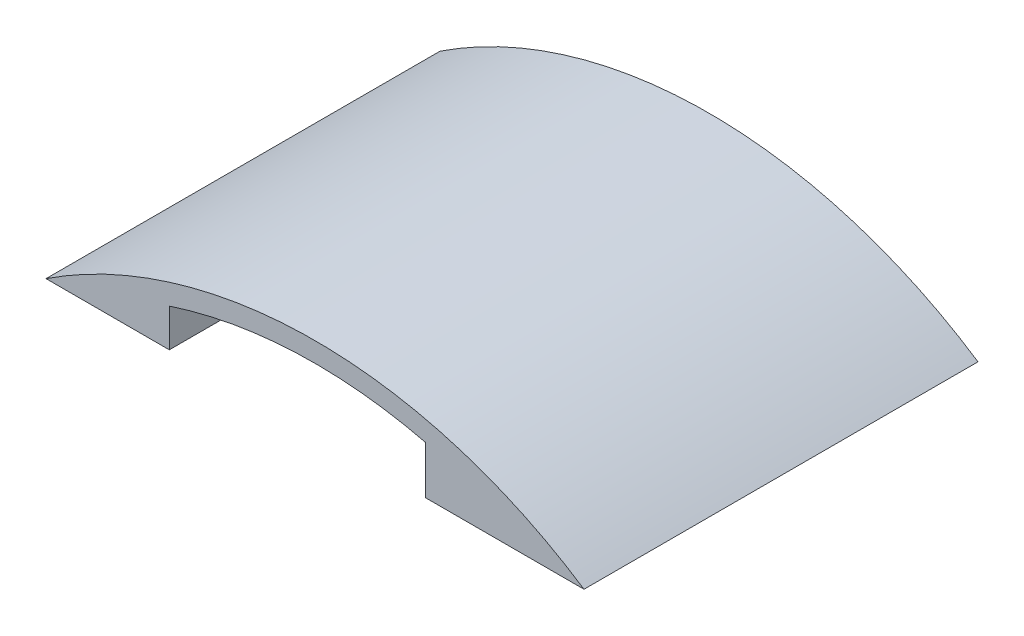
ISO-10303-21;
HEADER;
FILE_DESCRIPTION(('STEP AP214'),'2;1');
FILE_NAME('part.step','',(''),(''),'','','');
FILE_SCHEMA(('AUTOMOTIVE_DESIGN { 1 0 10303 214 1 1 1 1 }'));
ENDSEC;
DATA;
#1=APPLICATION_CONTEXT('core data for automotive mechanical design processes');
#2=APPLICATION_PROTOCOL_DEFINITION('international standard','automotive_design',2000,#1);
#3=PRODUCT_CONTEXT('',#1,'mechanical');
#4=PRODUCT('Part','Part','',(#3));
#5=PRODUCT_RELATED_PRODUCT_CATEGORY('part','',(#4));
#6=PRODUCT_DEFINITION_FORMATION('','',#4);
#7=PRODUCT_DEFINITION_CONTEXT('part definition',#1,'design');
#8=PRODUCT_DEFINITION('design','',#6,#7);
#9=PRODUCT_DEFINITION_SHAPE('','',#8);
#10=(LENGTH_UNIT() NAMED_UNIT(*) SI_UNIT(.MILLI.,.METRE.));
#11=(NAMED_UNIT(*) PLANE_ANGLE_UNIT() SI_UNIT($,.RADIAN.));
#12=(NAMED_UNIT(*) SI_UNIT($,.STERADIAN.) SOLID_ANGLE_UNIT());
#13=UNCERTAINTY_MEASURE_WITH_UNIT(LENGTH_MEASURE(1.E-05),#10,'distance_accuracy_value','');
#14=(GEOMETRIC_REPRESENTATION_CONTEXT(3) GLOBAL_UNCERTAINTY_ASSIGNED_CONTEXT((#13)) GLOBAL_UNIT_ASSIGNED_CONTEXT((#10,
#11,#12)) REPRESENTATION_CONTEXT('',''));
#15=CARTESIAN_POINT('',(0.,0.,0.));
#16=DIRECTION('',(0.,0.,1.));
#17=DIRECTION('',(1.,0.,0.));
#18=AXIS2_PLACEMENT_3D('',#15,#16,#17);
#19=CARTESIAN_POINT('',(1.02771467609974,-0.697983568078264,-95.2369376254187));
#20=DIRECTION('',(0.,0.,1.));
#21=DIRECTION('',(1.,0.,0.));
#22=AXIS2_PLACEMENT_3D('',#19,#20,#21);
#23=CYLINDRICAL_SURFACE('',#22,49.53);
#24=DIRECTION('',(0.,0.,1.));
#25=VECTOR('',#24,1.);
#26=CARTESIAN_POINT('',(28.3393681301243,40.6214366312332,-95.2369376254187));
#27=LINE('',#26,#25);
#28=CARTESIAN_POINT('',(28.3393681301243,40.6214366312332,-40.));
#29=VERTEX_POINT('',#28);
#30=CARTESIAN_POINT('',(28.3393681301243,40.6214366312332,0.));
#31=VERTEX_POINT('',#30);
#32=EDGE_CURVE('E135',#29,#31,#27,.T.);
#33=ORIENTED_EDGE('',*,*,#32,.F.);
#34=CARTESIAN_POINT('',(1.02771467609974,-0.697983568078264,-40.));
#35=DIRECTION('',(0.,0.,-1.));
#36=DIRECTION('',(0.,1.,0.));
#37=AXIS2_PLACEMENT_3D('',#34,#35,#36);
#38=CIRCLE('',#37,49.53);
#39=CARTESIAN_POINT('',(-26.2839387779248,40.6214366312332,-40.));
#40=VERTEX_POINT('',#39);
#41=EDGE_CURVE('E133',#29,#40,#38,.F.);
#42=ORIENTED_EDGE('',*,*,#41,.T.);
#43=DIRECTION('',(0.,0.,1.));
#44=VECTOR('',#43,1.);
#45=CARTESIAN_POINT('',(-26.2839387779248,40.6214366312332,-95.2369376254187));
#46=LINE('',#45,#44);
#47=CARTESIAN_POINT('',(-26.2839387779248,40.6214366312332,0.));
#48=VERTEX_POINT('',#47);
#49=EDGE_CURVE('E45',#40,#48,#46,.T.);
#50=ORIENTED_EDGE('',*,*,#49,.T.);
#51=CARTESIAN_POINT('',(1.02771467609974,-0.697983568078264,0.));
#52=DIRECTION('',(0.,0.,1.));
#53=DIRECTION('',(1.,0.,0.));
#54=AXIS2_PLACEMENT_3D('',#51,#52,#53);
#55=CIRCLE('',#54,49.53);
#56=EDGE_CURVE('E124',#31,#48,#55,.T.);
#57=ORIENTED_EDGE('',*,*,#56,.F.);
#58=EDGE_LOOP('',(#33,#42,#50,#57));
#59=FACE_BOUND('',#58,.T.);
#60=ADVANCED_FACE('F41',(#59),#23,.T.);
#61=CARTESIAN_POINT('',(28.3393681301243,40.6214366312332,-95.2369376254187));
#62=DIRECTION('',(0.,1.,0.));
#63=DIRECTION('',(-1.,0.,0.));
#64=AXIS2_PLACEMENT_3D('',#61,#62,#63);
#65=PLANE('',#64);
#66=DIRECTION('',(-1.,0.,0.));
#67=VECTOR('',#66,1.);
#68=CARTESIAN_POINT('',(28.3393681301243,40.6214366312332,-40.));
#69=LINE('',#68,#67);
#70=CARTESIAN_POINT('',(12.2371299745589,40.6214366312332,-40.));
#71=VERTEX_POINT('',#70);
#72=EDGE_CURVE('E80',#29,#71,#69,.T.);
#73=ORIENTED_EDGE('',*,*,#72,.F.);
#74=ORIENTED_EDGE('',*,*,#32,.T.);
#75=DIRECTION('',(-1.,0.,0.));
#76=VECTOR('',#75,1.);
#77=CARTESIAN_POINT('',(28.3393681301243,40.6214366312332,0.));
#78=LINE('',#77,#76);
#79=CARTESIAN_POINT('',(12.2371299745589,40.6214366312332,0.));
#80=VERTEX_POINT('',#79);
#81=EDGE_CURVE('E130',#31,#80,#78,.T.);
#82=ORIENTED_EDGE('',*,*,#81,.T.);
#83=DIRECTION('',(0.,0.,1.));
#84=VECTOR('',#83,1.);
#85=CARTESIAN_POINT('',(12.2371299745589,40.6214366312332,-95.2369376254187));
#86=LINE('',#85,#84);
#87=EDGE_CURVE('E129',#71,#80,#86,.T.);
#88=ORIENTED_EDGE('',*,*,#87,.F.);
#89=EDGE_LOOP('',(#73,#74,#82,#88));
#90=FACE_BOUND('',#89,.T.);
#91=ADVANCED_FACE('F144',(#90),#65,.F.);
#92=CARTESIAN_POINT('',(12.2371299745589,45.4912999148539,-95.2369376254187));
#93=DIRECTION('',(-1.,0.,0.));
#94=DIRECTION('',(0.,0.,1.));
#95=AXIS2_PLACEMENT_3D('',#92,#93,#94);
#96=PLANE('',#95);
#97=DIRECTION('',(0.,0.,1.));
#98=VECTOR('',#97,1.);
#99=CARTESIAN_POINT('',(12.2371299745589,45.4912999148539,-95.2369376254187));
#100=LINE('',#99,#98);
#101=CARTESIAN_POINT('',(12.2371299745589,45.4912999148539,-40.));
#102=VERTEX_POINT('',#101);
#103=CARTESIAN_POINT('',(12.2371299745589,45.4912999148539,0.));
#104=VERTEX_POINT('',#103);
#105=EDGE_CURVE('E101',#102,#104,#100,.T.);
#106=ORIENTED_EDGE('',*,*,#105,.F.);
#107=DIRECTION('',(0.,-1.,0.));
#108=VECTOR('',#107,1.);
#109=CARTESIAN_POINT('',(12.2371299745589,45.4912999148539,-40.));
#110=LINE('',#109,#108);
#111=EDGE_CURVE('E127',#102,#71,#110,.T.);
#112=ORIENTED_EDGE('',*,*,#111,.T.);
#113=ORIENTED_EDGE('',*,*,#87,.T.);
#114=DIRECTION('',(0.,-1.,0.));
#115=VECTOR('',#114,1.);
#116=CARTESIAN_POINT('',(12.2371299745589,45.4912999148539,0.));
#117=LINE('',#116,#115);
#118=EDGE_CURVE('E132',#104,#80,#117,.T.);
#119=ORIENTED_EDGE('',*,*,#118,.F.);
#120=EDGE_LOOP('',(#106,#112,#113,#119));
#121=FACE_BOUND('',#120,.T.);
#122=ADVANCED_FACE('F141',(#121),#96,.T.);
#123=CARTESIAN_POINT('',(1.02771467609974,-0.697983568078264,-95.2369376254187));
#124=DIRECTION('',(0.,0.,1.));
#125=DIRECTION('',(1.,0.,0.));
#126=AXIS2_PLACEMENT_3D('',#123,#124,#125);
#127=CYLINDRICAL_SURFACE('',#126,47.53);
#128=CARTESIAN_POINT('',(1.02771467609974,-0.697983568078264,-40.));
#129=DIRECTION('',(0.,0.,-1.));
#130=DIRECTION('',(0.,1.,0.));
#131=AXIS2_PLACEMENT_3D('',#128,#129,#130);
#132=CIRCLE('',#131,47.53);
#133=CARTESIAN_POINT('',(-13.7628700254411,44.4721338126254,-40.));
#134=VERTEX_POINT('',#133);
#135=EDGE_CURVE('E50',#102,#134,#132,.F.);
#136=ORIENTED_EDGE('',*,*,#135,.F.);
#137=ORIENTED_EDGE('',*,*,#105,.T.);
#138=CARTESIAN_POINT('',(1.02771467609974,-0.697983568078264,0.));
#139=DIRECTION('',(0.,0.,1.));
#140=DIRECTION('',(1.,0.,0.));
#141=AXIS2_PLACEMENT_3D('',#138,#139,#140);
#142=CIRCLE('',#141,47.53);
#143=CARTESIAN_POINT('',(-13.7628700254411,44.4721338126254,0.));
#144=VERTEX_POINT('',#143);
#145=EDGE_CURVE('E118',#104,#144,#142,.T.);
#146=ORIENTED_EDGE('',*,*,#145,.T.);
#147=DIRECTION('',(0.,0.,1.));
#148=VECTOR('',#147,1.);
#149=CARTESIAN_POINT('',(-13.7628700254411,44.4721338126254,-95.2369376254187));
#150=LINE('',#149,#148);
#151=EDGE_CURVE('E112',#134,#144,#150,.T.);
#152=ORIENTED_EDGE('',*,*,#151,.F.);
#153=EDGE_LOOP('',(#136,#137,#146,#152));
#154=FACE_BOUND('',#153,.T.);
#155=ADVANCED_FACE('F159',(#154),#127,.F.);
#156=CARTESIAN_POINT('',(-13.7628700254411,40.6214366312332,-95.2369376254187));
#157=DIRECTION('',(1.,0.,0.));
#158=DIRECTION('',(0.,1.,0.));
#159=AXIS2_PLACEMENT_3D('',#156,#157,#158);
#160=PLANE('',#159);
#161=DIRECTION('',(0.,0.,1.));
#162=VECTOR('',#161,1.);
#163=CARTESIAN_POINT('',(-13.7628700254411,40.6214366312332,-95.2369376254187));
#164=LINE('',#163,#162);
#165=CARTESIAN_POINT('',(-13.7628700254411,40.6214366312332,-40.));
#166=VERTEX_POINT('',#165);
#167=CARTESIAN_POINT('',(-13.7628700254411,40.6214366312332,0.));
#168=VERTEX_POINT('',#167);
#169=EDGE_CURVE('E63',#166,#168,#164,.T.);
#170=ORIENTED_EDGE('',*,*,#169,.F.);
#171=DIRECTION('',(0.,1.,0.));
#172=VECTOR('',#171,1.);
#173=CARTESIAN_POINT('',(-13.7628700254411,40.6214366312332,-40.));
#174=LINE('',#173,#172);
#175=EDGE_CURVE('E107',#166,#134,#174,.T.);
#176=ORIENTED_EDGE('',*,*,#175,.T.);
#177=ORIENTED_EDGE('',*,*,#151,.T.);
#178=DIRECTION('',(0.,1.,0.));
#179=VECTOR('',#178,1.);
#180=CARTESIAN_POINT('',(-13.7628700254411,40.6214366312332,0.));
#181=LINE('',#180,#179);
#182=EDGE_CURVE('E110',#168,#144,#181,.T.);
#183=ORIENTED_EDGE('',*,*,#182,.F.);
#184=EDGE_LOOP('',(#170,#176,#177,#183));
#185=FACE_BOUND('',#184,.T.);
#186=ADVANCED_FACE('F105',(#185),#160,.T.);
#187=CARTESIAN_POINT('',(-13.7628700254411,40.6214366312332,-95.2369376254187));
#188=DIRECTION('',(0.,1.,0.));
#189=DIRECTION('',(-1.,0.,0.));
#190=AXIS2_PLACEMENT_3D('',#187,#188,#189);
#191=PLANE('',#190);
#192=DIRECTION('',(-1.,0.,0.));
#193=VECTOR('',#192,1.);
#194=CARTESIAN_POINT('',(-13.7628700254411,40.6214366312332,-40.));
#195=LINE('',#194,#193);
#196=EDGE_CURVE('E11',#166,#40,#195,.T.);
#197=ORIENTED_EDGE('',*,*,#196,.F.);
#198=ORIENTED_EDGE('',*,*,#169,.T.);
#199=DIRECTION('',(-1.,0.,0.));
#200=VECTOR('',#199,1.);
#201=CARTESIAN_POINT('',(-13.7628700254411,40.6214366312332,0.));
#202=LINE('',#201,#200);
#203=EDGE_CURVE('E111',#168,#48,#202,.T.);
#204=ORIENTED_EDGE('',*,*,#203,.T.);
#205=ORIENTED_EDGE('',*,*,#49,.F.);
#206=EDGE_LOOP('',(#197,#198,#204,#205));
#207=FACE_BOUND('',#206,.T.);
#208=ADVANCED_FACE('F113',(#207),#191,.F.);
#209=CARTESIAN_POINT('',(1.02771467609974,-0.697983568078264,0.));
#210=DIRECTION('',(0.,0.,1.));
#211=DIRECTION('',(1.,0.,0.));
#212=AXIS2_PLACEMENT_3D('',#209,#210,#211);
#213=PLANE('',#212);
#214=ORIENTED_EDGE('',*,*,#56,.T.);
#215=ORIENTED_EDGE('',*,*,#203,.F.);
#216=ORIENTED_EDGE('',*,*,#182,.T.);
#217=ORIENTED_EDGE('',*,*,#145,.F.);
#218=ORIENTED_EDGE('',*,*,#118,.T.);
#219=ORIENTED_EDGE('',*,*,#81,.F.);
#220=EDGE_LOOP('',(#214,#215,#216,#217,#218,#219));
#221=FACE_BOUND('',#220,.T.);
#222=ADVANCED_FACE('F148',(#221),#213,.T.);
#223=CARTESIAN_POINT('',(-15.,41.6668632414211,-40.));
#224=DIRECTION('',(0.,0.,-1.));
#225=DIRECTION('',(0.,1.,0.));
#226=AXIS2_PLACEMENT_3D('',#223,#224,#225);
#227=PLANE('',#226);
#228=ORIENTED_EDGE('',*,*,#41,.F.);
#229=ORIENTED_EDGE('',*,*,#72,.T.);
#230=ORIENTED_EDGE('',*,*,#111,.F.);
#231=ORIENTED_EDGE('',*,*,#135,.T.);
#232=ORIENTED_EDGE('',*,*,#175,.F.);
#233=ORIENTED_EDGE('',*,*,#196,.T.);
#234=EDGE_LOOP('',(#228,#229,#230,#231,#232,#233));
#235=FACE_BOUND('',#234,.T.);
#236=ADVANCED_FACE('F43',(#235),#227,.T.);
#237=CLOSED_SHELL('',(#60,#91,#122,#155,#186,#208,#222,#236));
#238=MANIFOLD_SOLID_BREP('B2',#237);
#239=ADVANCED_BREP_SHAPE_REPRESENTATION('',(#18,#238),#14);
#240=SHAPE_DEFINITION_REPRESENTATION(#9,#239);
ENDSEC;
END-ISO-10303-21;
